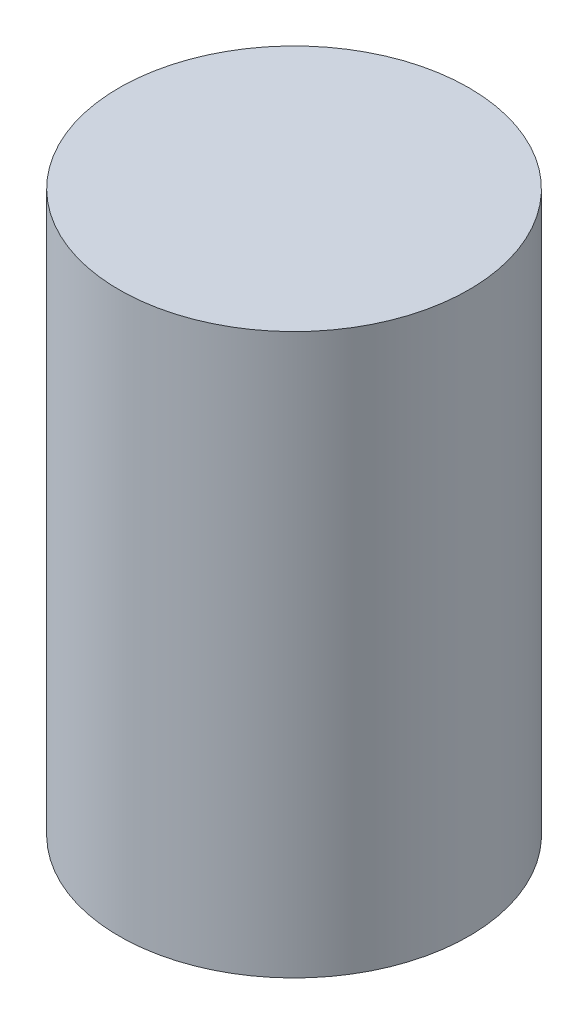
ISO-10303-21;
HEADER;
FILE_DESCRIPTION(('STEP AP214'),'2;1');
FILE_NAME('part.step','',(''),(''),'','','');
FILE_SCHEMA(('AUTOMOTIVE_DESIGN { 1 0 10303 214 1 1 1 1 }'));
ENDSEC;
DATA;
#1=APPLICATION_CONTEXT('core data for automotive mechanical design processes');
#2=APPLICATION_PROTOCOL_DEFINITION('international standard','automotive_design',2000,#1);
#3=PRODUCT_CONTEXT('',#1,'mechanical');
#4=PRODUCT('Part','Part','',(#3));
#5=PRODUCT_RELATED_PRODUCT_CATEGORY('part','',(#4));
#6=PRODUCT_DEFINITION_FORMATION('','',#4);
#7=PRODUCT_DEFINITION_CONTEXT('part definition',#1,'design');
#8=PRODUCT_DEFINITION('design','',#6,#7);
#9=PRODUCT_DEFINITION_SHAPE('','',#8);
#10=(LENGTH_UNIT() NAMED_UNIT(*) SI_UNIT(.MILLI.,.METRE.));
#11=(NAMED_UNIT(*) PLANE_ANGLE_UNIT() SI_UNIT($,.RADIAN.));
#12=(NAMED_UNIT(*) SI_UNIT($,.STERADIAN.) SOLID_ANGLE_UNIT());
#13=UNCERTAINTY_MEASURE_WITH_UNIT(LENGTH_MEASURE(1.E-05),#10,'distance_accuracy_value','');
#14=(GEOMETRIC_REPRESENTATION_CONTEXT(3) GLOBAL_UNCERTAINTY_ASSIGNED_CONTEXT((#13)) GLOBAL_UNIT_ASSIGNED_CONTEXT((#10,
#11,#12)) REPRESENTATION_CONTEXT('',''));
#15=CARTESIAN_POINT('',(0.,0.,0.));
#16=DIRECTION('',(0.,0.,1.));
#17=DIRECTION('',(1.,0.,0.));
#18=AXIS2_PLACEMENT_3D('',#15,#16,#17);
#19=CARTESIAN_POINT('',(0.,-27.0147302899266,0.));
#20=DIRECTION('',(0.,-1.,0.));
#21=DIRECTION('',(0.,0.,-1.));
#22=AXIS2_PLACEMENT_3D('',#19,#20,#21);
#23=CYLINDRICAL_SURFACE('',#22,12.5);
#24=CARTESIAN_POINT('',(0.,-7.94565217391304,0.));
#25=DIRECTION('',(0.,-1.,0.));
#26=DIRECTION('',(0.,0.,-1.));
#27=AXIS2_PLACEMENT_3D('',#24,#25,#26);
#28=CIRCLE('',#27,12.5);
#29=CARTESIAN_POINT('',(0.,-7.94565217391304,-12.5));
#30=VERTEX_POINT('',#29);
#31=EDGE_CURVE('E10',#30,#30,#28,.T.);
#32=ORIENTED_EDGE('',*,*,#31,.F.);
#33=EDGE_LOOP('',(#32));
#34=FACE_BOUND('',#33,.T.);
#35=CARTESIAN_POINT('',(0.,32.054347826087,0.));
#36=DIRECTION('',(0.,-1.,0.));
#37=DIRECTION('',(0.,0.,-1.));
#38=AXIS2_PLACEMENT_3D('',#35,#36,#37);
#39=CIRCLE('',#38,12.5);
#40=CARTESIAN_POINT('',(0.,32.054347826087,-12.5));
#41=VERTEX_POINT('',#40);
#42=EDGE_CURVE('E52',#41,#41,#39,.T.);
#43=ORIENTED_EDGE('',*,*,#42,.T.);
#44=EDGE_LOOP('',(#43));
#45=FACE_BOUND('',#44,.T.);
#46=ADVANCED_FACE('F45',(#34,#45),#23,.T.);
#47=CARTESIAN_POINT('',(0.,-7.94565217391304,0.));
#48=DIRECTION('',(0.,1.,0.));
#49=DIRECTION('',(0.,0.,1.));
#50=AXIS2_PLACEMENT_3D('',#47,#48,#49);
#51=PLANE('',#50);
#52=ORIENTED_EDGE('',*,*,#31,.T.);
#53=EDGE_LOOP('',(#52));
#54=FACE_BOUND('',#53,.T.);
#55=ADVANCED_FACE('F62',(#54),#51,.F.);
#56=CARTESIAN_POINT('',(0.,32.054347826087,0.));
#57=DIRECTION('',(0.,1.,0.));
#58=DIRECTION('',(0.,0.,1.));
#59=AXIS2_PLACEMENT_3D('',#56,#57,#58);
#60=PLANE('',#59);
#61=ORIENTED_EDGE('',*,*,#42,.F.);
#62=EDGE_LOOP('',(#61));
#63=FACE_BOUND('',#62,.T.);
#64=ADVANCED_FACE('F60',(#63),#60,.T.);
#65=CLOSED_SHELL('',(#46,#55,#64));
#66=MANIFOLD_SOLID_BREP('B2',#65);
#67=ADVANCED_BREP_SHAPE_REPRESENTATION('',(#18,#66),#14);
#68=SHAPE_DEFINITION_REPRESENTATION(#9,#67);
ENDSEC;
END-ISO-10303-21;
